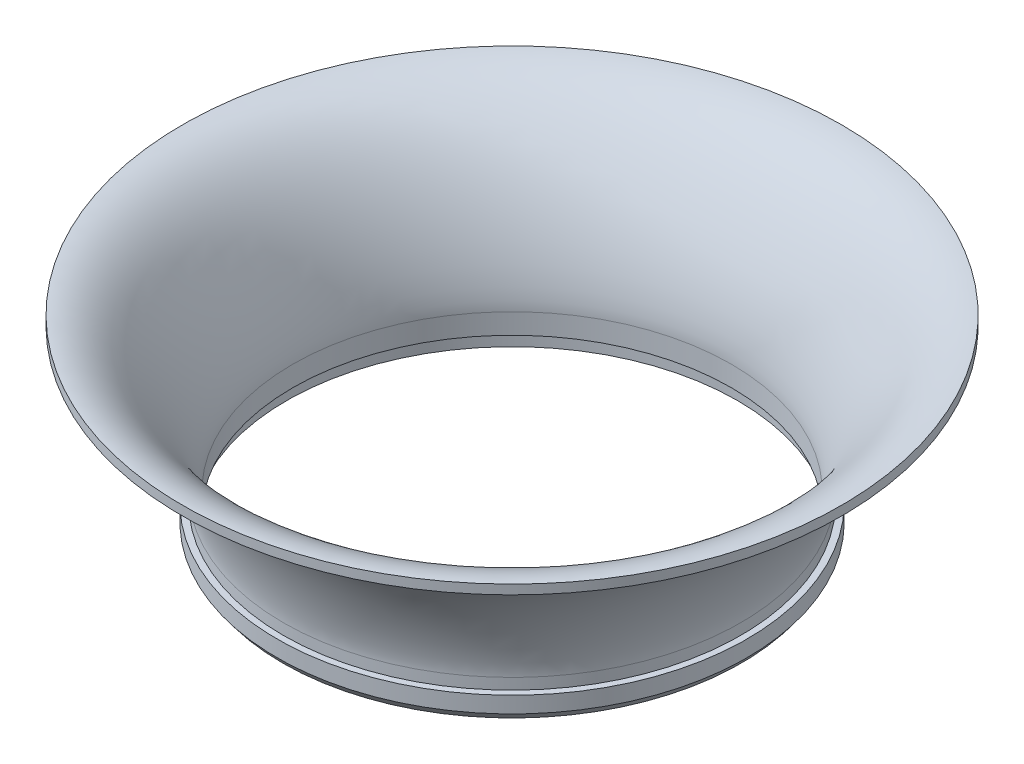
ISO-10303-21;
HEADER;
FILE_DESCRIPTION(('STEP AP214'),'2;1');
FILE_NAME('part.step','',(''),(''),'','','');
FILE_SCHEMA(('AUTOMOTIVE_DESIGN { 1 0 10303 214 1 1 1 1 }'));
ENDSEC;
DATA;
#1=APPLICATION_CONTEXT('core data for automotive mechanical design processes');
#2=APPLICATION_PROTOCOL_DEFINITION('international standard','automotive_design',2000,#1);
#3=PRODUCT_CONTEXT('',#1,'mechanical');
#4=PRODUCT('Part','Part','',(#3));
#5=PRODUCT_RELATED_PRODUCT_CATEGORY('part','',(#4));
#6=PRODUCT_DEFINITION_FORMATION('','',#4);
#7=PRODUCT_DEFINITION_CONTEXT('part definition',#1,'design');
#8=PRODUCT_DEFINITION('design','',#6,#7);
#9=PRODUCT_DEFINITION_SHAPE('','',#8);
#10=(LENGTH_UNIT() NAMED_UNIT(*) SI_UNIT(.MILLI.,.METRE.));
#11=(NAMED_UNIT(*) PLANE_ANGLE_UNIT() SI_UNIT($,.RADIAN.));
#12=(NAMED_UNIT(*) SI_UNIT($,.STERADIAN.) SOLID_ANGLE_UNIT());
#13=UNCERTAINTY_MEASURE_WITH_UNIT(LENGTH_MEASURE(1.E-05),#10,'distance_accuracy_value','');
#14=(GEOMETRIC_REPRESENTATION_CONTEXT(3) GLOBAL_UNCERTAINTY_ASSIGNED_CONTEXT((#13)) GLOBAL_UNIT_ASSIGNED_CONTEXT((#10,
#11,#12)) REPRESENTATION_CONTEXT('',''));
#15=CARTESIAN_POINT('',(0.,0.,0.));
#16=DIRECTION('',(0.,0.,1.));
#17=DIRECTION('',(1.,0.,0.));
#18=AXIS2_PLACEMENT_3D('',#15,#16,#17);
#19=CARTESIAN_POINT('',(0.,1.2,0.));
#20=DIRECTION('',(0.,1.,0.));
#21=DIRECTION('',(0.,0.,1.));
#22=AXIS2_PLACEMENT_3D('',#19,#20,#21);
#23=CONICAL_SURFACE('',#22,37.7,0.643501108793283);
#24=CARTESIAN_POINT('',(0.,0.,0.));
#25=DIRECTION('',(0.,-1.,0.));
#26=DIRECTION('',(0.,0.,-1.));
#27=AXIS2_PLACEMENT_3D('',#24,#25,#26);
#28=CIRCLE('',#27,36.8);
#29=CARTESIAN_POINT('',(0.,0.,-36.8));
#30=VERTEX_POINT('',#29);
#31=EDGE_CURVE('E68',#30,#30,#28,.T.);
#32=ORIENTED_EDGE('',*,*,#31,.F.);
#33=EDGE_LOOP('',(#32));
#34=FACE_BOUND('',#33,.T.);
#35=CARTESIAN_POINT('',(0.,1.2,0.));
#36=DIRECTION('',(0.,-1.,0.));
#37=DIRECTION('',(0.,0.,-1.));
#38=AXIS2_PLACEMENT_3D('',#35,#36,#37);
#39=CIRCLE('',#38,37.7);
#40=CARTESIAN_POINT('',(0.,1.2,-37.7));
#41=VERTEX_POINT('',#40);
#42=EDGE_CURVE('E10',#41,#41,#39,.T.);
#43=ORIENTED_EDGE('',*,*,#42,.T.);
#44=EDGE_LOOP('',(#43));
#45=FACE_BOUND('',#44,.T.);
#46=ADVANCED_FACE('F31',(#34,#45),#23,.T.);
#47=CARTESIAN_POINT('',(0.,0.,0.));
#48=DIRECTION('',(0.,-1.,0.));
#49=DIRECTION('',(0.,0.,-1.));
#50=AXIS2_PLACEMENT_3D('',#47,#48,#49);
#51=CYLINDRICAL_SURFACE('',#50,37.7);
#52=ORIENTED_EDGE('',*,*,#42,.F.);
#53=EDGE_LOOP('',(#52));
#54=FACE_BOUND('',#53,.T.);
#55=CARTESIAN_POINT('',(0.,3.8,0.));
#56=DIRECTION('',(0.,-1.,0.));
#57=DIRECTION('',(0.,0.,-1.));
#58=AXIS2_PLACEMENT_3D('',#55,#56,#57);
#59=CIRCLE('',#58,37.7);
#60=CARTESIAN_POINT('',(0.,3.8,-37.7));
#61=VERTEX_POINT('',#60);
#62=EDGE_CURVE('E37',#61,#61,#59,.T.);
#63=ORIENTED_EDGE('',*,*,#62,.T.);
#64=EDGE_LOOP('',(#63));
#65=FACE_BOUND('',#64,.T.);
#66=ADVANCED_FACE('F95',(#54,#65),#51,.T.);
#67=CARTESIAN_POINT('',(-37.7,3.8,0.));
#68=DIRECTION('',(0.,-1.,0.));
#69=DIRECTION('',(0.,0.,-1.));
#70=AXIS2_PLACEMENT_3D('',#67,#68,#69);
#71=PLANE('',#70);
#72=ORIENTED_EDGE('',*,*,#62,.F.);
#73=EDGE_LOOP('',(#72));
#74=FACE_BOUND('',#73,.T.);
#75=CARTESIAN_POINT('',(0.,3.8,0.));
#76=DIRECTION('',(0.,-1.,0.));
#77=DIRECTION('',(0.,0.,-1.));
#78=AXIS2_PLACEMENT_3D('',#75,#76,#77);
#79=CIRCLE('',#78,36.7);
#80=CARTESIAN_POINT('',(0.,3.8,-36.7));
#81=VERTEX_POINT('',#80);
#82=EDGE_CURVE('E41',#81,#81,#79,.T.);
#83=ORIENTED_EDGE('',*,*,#82,.T.);
#84=EDGE_LOOP('',(#83));
#85=FACE_BOUND('',#84,.T.);
#86=ADVANCED_FACE('F92',(#74,#85),#71,.F.);
#87=CARTESIAN_POINT('',(0.,0.,0.));
#88=DIRECTION('',(0.,-1.,0.));
#89=DIRECTION('',(0.,0.,-1.));
#90=AXIS2_PLACEMENT_3D('',#87,#88,#89);
#91=CYLINDRICAL_SURFACE('',#90,36.7);
#92=ORIENTED_EDGE('',*,*,#82,.F.);
#93=EDGE_LOOP('',(#92));
#94=FACE_BOUND('',#93,.T.);
#95=CARTESIAN_POINT('',(0.,5.56756756756757,0.));
#96=DIRECTION('',(0.,-1.,0.));
#97=DIRECTION('',(0.,0.,-1.));
#98=AXIS2_PLACEMENT_3D('',#95,#96,#97);
#99=CIRCLE('',#98,36.7);
#100=CARTESIAN_POINT('',(0.,5.56756756756757,-36.7));
#101=VERTEX_POINT('',#100);
#102=EDGE_CURVE('E45',#101,#101,#99,.T.);
#103=ORIENTED_EDGE('',*,*,#102,.T.);
#104=EDGE_LOOP('',(#103));
#105=FACE_BOUND('',#104,.T.);
#106=ADVANCED_FACE('F87',(#94,#105),#91,.T.);
#107=CARTESIAN_POINT('',(-52.9,28.5,0.));
#108=CARTESIAN_POINT('',(-51.8085613642345,28.5,0.));
#109=CARTESIAN_POINT('',(-49.6696735130081,28.0381142028083,0.));
#110=CARTESIAN_POINT('',(-46.6101429987043,26.1107477921444,0.));
#111=CARTESIAN_POINT('',(-43.7807065707319,23.1569328532077,0.));
#112=CARTESIAN_POINT('',(-41.3192983510918,19.5127384182467,0.));
#113=CARTESIAN_POINT('',(-39.3091174005217,15.5370592322053,0.));
#114=CARTESIAN_POINT('',(-38.0655220628745,12.2509431866075,0.));
#115=CARTESIAN_POINT('',(-37.3571413133861,9.82635916383521,0.));
#116=CARTESIAN_POINT('',(-36.9751647465086,8.15762602215668,0.));
#117=CARTESIAN_POINT('',(-36.7856050663226,6.9449181590841,0.));
#118=CARTESIAN_POINT('',(-36.7117082482036,6.09605489374727,0.));
#119=CARTESIAN_POINT('',(-36.7,5.75039282109714,0.));
#120=CARTESIAN_POINT('',(-36.7,5.56756756756757,0.));
#121=B_SPLINE_CURVE_WITH_KNOTS('',3,(#107,#108,#109,#110,#111,#112,#113,#114,#115,#116,#117,
#118,#119,#120),.UNSPECIFIED.,.F.,.F.,(4,1,1,1,1,1,1,1,1,1,1,4),(0.,0.125,0.25,0.375,0.5,0.625,
0.75,0.8125,0.875,0.9375,0.96875,1.),.UNSPECIFIED.);
#122=CARTESIAN_POINT('',(0.,0.,0.));
#123=DIRECTION('',(0.,-1.,0.));
#124=AXIS1_PLACEMENT('',#122,#123);
#125=SURFACE_OF_REVOLUTION('',#121,#124);
#126=ORIENTED_EDGE('',*,*,#102,.F.);
#127=EDGE_LOOP('',(#126));
#128=FACE_BOUND('',#127,.T.);
#129=CARTESIAN_POINT('',(0.,28.5,0.));
#130=DIRECTION('',(0.,-1.,0.));
#131=DIRECTION('',(0.,0.,-1.));
#132=AXIS2_PLACEMENT_3D('',#129,#130,#131);
#133=CIRCLE('',#132,52.9);
#134=CARTESIAN_POINT('',(0.,28.5,-52.9));
#135=VERTEX_POINT('',#134);
#136=EDGE_CURVE('E50',#135,#135,#133,.T.);
#137=ORIENTED_EDGE('',*,*,#136,.T.);
#138=EDGE_LOOP('',(#137));
#139=FACE_BOUND('',#138,.T.);
#140=ADVANCED_FACE('F82',(#128,#139),#125,.T.);
#141=CARTESIAN_POINT('',(0.,0.,0.));
#142=DIRECTION('',(0.,-1.,0.));
#143=DIRECTION('',(0.,0.,-1.));
#144=AXIS2_PLACEMENT_3D('',#141,#142,#143);
#145=CYLINDRICAL_SURFACE('',#144,52.9);
#146=ORIENTED_EDGE('',*,*,#136,.F.);
#147=EDGE_LOOP('',(#146));
#148=FACE_BOUND('',#147,.T.);
#149=CARTESIAN_POINT('',(0.,30.,0.));
#150=DIRECTION('',(0.,-1.,0.));
#151=DIRECTION('',(0.,0.,-1.));
#152=AXIS2_PLACEMENT_3D('',#149,#150,#151);
#153=CIRCLE('',#152,52.9);
#154=CARTESIAN_POINT('',(0.,30.,-52.9));
#155=VERTEX_POINT('',#154);
#156=EDGE_CURVE('E53',#155,#155,#153,.T.);
#157=ORIENTED_EDGE('',*,*,#156,.T.);
#158=EDGE_LOOP('',(#157));
#159=FACE_BOUND('',#158,.T.);
#160=ADVANCED_FACE('F86',(#148,#159),#145,.T.);
#161=CARTESIAN_POINT('',(-35.2,5.56756756756757,0.));
#162=CARTESIAN_POINT('',(-35.2,12.055305214804,0.));
#163=CARTESIAN_POINT('',(-42.3688447126277,30.,0.));
#164=CARTESIAN_POINT('',(-52.9,30.,0.));
#165=B_SPLINE_CURVE_WITH_KNOTS('',3,(#161,#162,#163,#164),.UNSPECIFIED.,.F.,.F.,(4,4),(0.,1.),.UNSPECIFIED.);
#166=CARTESIAN_POINT('',(0.,0.,0.));
#167=DIRECTION('',(0.,-1.,0.));
#168=AXIS1_PLACEMENT('',#166,#167);
#169=SURFACE_OF_REVOLUTION('',#165,#168);
#170=ORIENTED_EDGE('',*,*,#156,.F.);
#171=EDGE_LOOP('',(#170));
#172=FACE_BOUND('',#171,.T.);
#173=CARTESIAN_POINT('',(0.,5.56756756756757,0.));
#174=DIRECTION('',(0.,-1.,0.));
#175=DIRECTION('',(0.,0.,-1.));
#176=AXIS2_PLACEMENT_3D('',#173,#174,#175);
#177=CIRCLE('',#176,35.2);
#178=CARTESIAN_POINT('',(0.,5.56756756756757,-35.2));
#179=VERTEX_POINT('',#178);
#180=EDGE_CURVE('E56',#179,#179,#177,.T.);
#181=ORIENTED_EDGE('',*,*,#180,.T.);
#182=EDGE_LOOP('',(#181));
#183=FACE_BOUND('',#182,.T.);
#184=ADVANCED_FACE('F125',(#172,#183),#169,.T.);
#185=CARTESIAN_POINT('',(0.,0.,0.));
#186=DIRECTION('',(0.,-1.,0.));
#187=DIRECTION('',(0.,0.,-1.));
#188=AXIS2_PLACEMENT_3D('',#185,#186,#187);
#189=CYLINDRICAL_SURFACE('',#188,35.2);
#190=ORIENTED_EDGE('',*,*,#180,.F.);
#191=EDGE_LOOP('',(#190));
#192=FACE_BOUND('',#191,.T.);
#193=CARTESIAN_POINT('',(0.,2.3,0.));
#194=DIRECTION('',(0.,-1.,0.));
#195=DIRECTION('',(0.,0.,-1.));
#196=AXIS2_PLACEMENT_3D('',#193,#194,#195);
#197=CIRCLE('',#196,35.2);
#198=CARTESIAN_POINT('',(0.,2.3,-35.2));
#199=VERTEX_POINT('',#198);
#200=EDGE_CURVE('E59',#199,#199,#197,.T.);
#201=ORIENTED_EDGE('',*,*,#200,.T.);
#202=EDGE_LOOP('',(#201));
#203=FACE_BOUND('',#202,.T.);
#204=ADVANCED_FACE('F122',(#192,#203),#189,.F.);
#205=CARTESIAN_POINT('',(-36.2,2.3,0.));
#206=DIRECTION('',(0.,1.,0.));
#207=DIRECTION('',(0.,0.,1.));
#208=AXIS2_PLACEMENT_3D('',#205,#206,#207);
#209=PLANE('',#208);
#210=ORIENTED_EDGE('',*,*,#200,.F.);
#211=EDGE_LOOP('',(#210));
#212=FACE_BOUND('',#211,.T.);
#213=CARTESIAN_POINT('',(0.,2.3,0.));
#214=DIRECTION('',(0.,-1.,0.));
#215=DIRECTION('',(0.,0.,-1.));
#216=AXIS2_PLACEMENT_3D('',#213,#214,#215);
#217=CIRCLE('',#216,36.2);
#218=CARTESIAN_POINT('',(0.,2.3,-36.2));
#219=VERTEX_POINT('',#218);
#220=EDGE_CURVE('E62',#219,#219,#217,.T.);
#221=ORIENTED_EDGE('',*,*,#220,.T.);
#222=EDGE_LOOP('',(#221));
#223=FACE_BOUND('',#222,.T.);
#224=ADVANCED_FACE('F115',(#212,#223),#209,.F.);
#225=CARTESIAN_POINT('',(0.,0.,0.));
#226=DIRECTION('',(0.,-1.,0.));
#227=DIRECTION('',(0.,0.,-1.));
#228=AXIS2_PLACEMENT_3D('',#225,#226,#227);
#229=CYLINDRICAL_SURFACE('',#228,36.2);
#230=ORIENTED_EDGE('',*,*,#220,.F.);
#231=EDGE_LOOP('',(#230));
#232=FACE_BOUND('',#231,.T.);
#233=CARTESIAN_POINT('',(0.,0.,0.));
#234=DIRECTION('',(0.,-1.,0.));
#235=DIRECTION('',(0.,0.,-1.));
#236=AXIS2_PLACEMENT_3D('',#233,#234,#235);
#237=CIRCLE('',#236,36.2);
#238=CARTESIAN_POINT('',(0.,0.,-36.2));
#239=VERTEX_POINT('',#238);
#240=EDGE_CURVE('E65',#239,#239,#237,.T.);
#241=ORIENTED_EDGE('',*,*,#240,.T.);
#242=EDGE_LOOP('',(#241));
#243=FACE_BOUND('',#242,.T.);
#244=ADVANCED_FACE('F109',(#232,#243),#229,.F.);
#245=CARTESIAN_POINT('',(-36.8,0.,0.));
#246=DIRECTION('',(0.,1.,0.));
#247=DIRECTION('',(0.,0.,1.));
#248=AXIS2_PLACEMENT_3D('',#245,#246,#247);
#249=PLANE('',#248);
#250=ORIENTED_EDGE('',*,*,#240,.F.);
#251=EDGE_LOOP('',(#250));
#252=FACE_BOUND('',#251,.T.);
#253=ORIENTED_EDGE('',*,*,#31,.T.);
#254=EDGE_LOOP('',(#253));
#255=FACE_BOUND('',#254,.T.);
#256=ADVANCED_FACE('F107',(#252,#255),#249,.F.);
#257=CLOSED_SHELL('',(#46,#66,#86,#106,#140,#160,#184,#204,#224,#244,#256));
#258=MANIFOLD_SOLID_BREP('B2',#257);
#259=ADVANCED_BREP_SHAPE_REPRESENTATION('',(#18,#258),#14);
#260=SHAPE_DEFINITION_REPRESENTATION(#9,#259);
ENDSEC;
END-ISO-10303-21;
